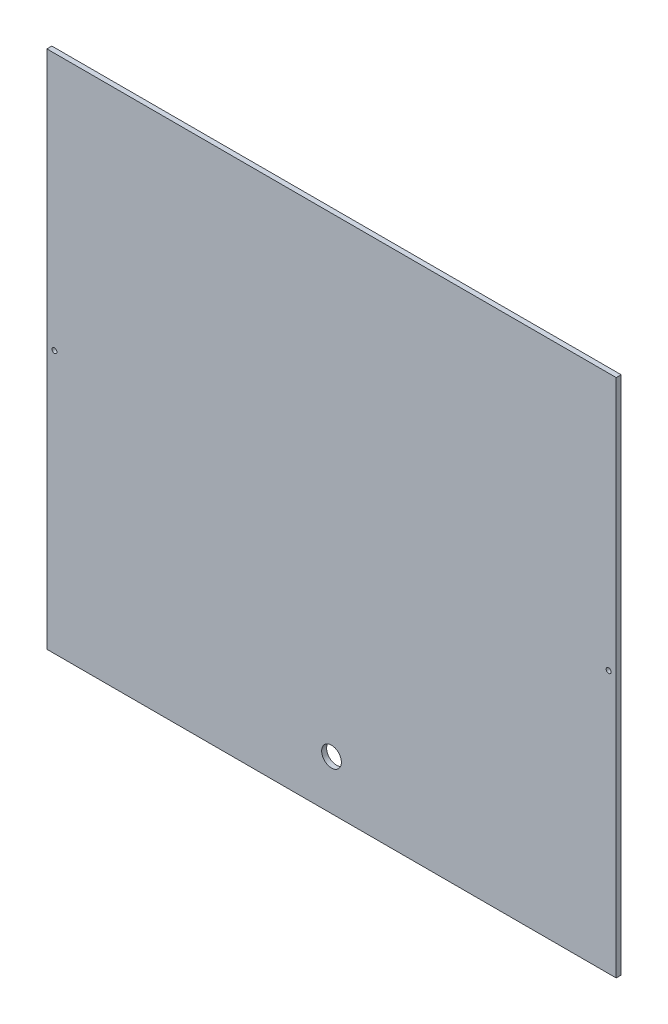
ISO-10303-21;
HEADER;
FILE_DESCRIPTION(('STEP AP214'),'2;1');
FILE_NAME('part.step','',(''),(''),'','','');
FILE_SCHEMA(('AUTOMOTIVE_DESIGN { 1 0 10303 214 1 1 1 1 }'));
ENDSEC;
DATA;
#1=APPLICATION_CONTEXT('core data for automotive mechanical design processes');
#2=APPLICATION_PROTOCOL_DEFINITION('international standard','automotive_design',2000,#1);
#3=PRODUCT_CONTEXT('',#1,'mechanical');
#4=PRODUCT('Part','Part','',(#3));
#5=PRODUCT_RELATED_PRODUCT_CATEGORY('part','',(#4));
#6=PRODUCT_DEFINITION_FORMATION('','',#4);
#7=PRODUCT_DEFINITION_CONTEXT('part definition',#1,'design');
#8=PRODUCT_DEFINITION('design','',#6,#7);
#9=PRODUCT_DEFINITION_SHAPE('','',#8);
#10=(LENGTH_UNIT() NAMED_UNIT(*) SI_UNIT(.MILLI.,.METRE.));
#11=(NAMED_UNIT(*) PLANE_ANGLE_UNIT() SI_UNIT($,.RADIAN.));
#12=(NAMED_UNIT(*) SI_UNIT($,.STERADIAN.) SOLID_ANGLE_UNIT());
#13=UNCERTAINTY_MEASURE_WITH_UNIT(LENGTH_MEASURE(1.E-05),#10,'distance_accuracy_value','');
#14=(GEOMETRIC_REPRESENTATION_CONTEXT(3) GLOBAL_UNCERTAINTY_ASSIGNED_CONTEXT((#13)) GLOBAL_UNIT_ASSIGNED_CONTEXT((#10,
#11,#12)) REPRESENTATION_CONTEXT('',''));
#15=CARTESIAN_POINT('',(0.,0.,0.));
#16=DIRECTION('',(0.,0.,1.));
#17=DIRECTION('',(1.,0.,0.));
#18=AXIS2_PLACEMENT_3D('',#15,#16,#17);
#19=CARTESIAN_POINT('',(0.,0.,5.));
#20=DIRECTION('',(0.,0.,-1.));
#21=DIRECTION('',(-1.,0.,0.));
#22=AXIS2_PLACEMENT_3D('',#19,#20,#21);
#23=PLANE('',#22);
#24=CARTESIAN_POINT('',(288.34878885,50.,5.));
#25=DIRECTION('',(0.,0.,-1.));
#26=DIRECTION('',(-1.,0.,0.));
#27=AXIS2_PLACEMENT_3D('',#24,#25,#26);
#28=CIRCLE('',#27,9.99999999999998);
#29=CARTESIAN_POINT('',(278.34878885,50.,5.));
#30=VERTEX_POINT('',#29);
#31=EDGE_CURVE('E123',#30,#30,#28,.T.);
#32=ORIENTED_EDGE('',*,*,#31,.T.);
#33=EDGE_LOOP('',(#32));
#34=FACE_BOUND('',#33,.T.);
#35=DIRECTION('',(0.,-1.,0.));
#36=VECTOR('',#35,1.);
#37=CARTESIAN_POINT('',(0.,0.,5.));
#38=LINE('',#37,#36);
#39=CARTESIAN_POINT('',(0.,526.6975777,5.));
#40=VERTEX_POINT('',#39);
#41=CARTESIAN_POINT('',(0.,0.,5.));
#42=VERTEX_POINT('',#41);
#43=EDGE_CURVE('E87',#40,#42,#38,.T.);
#44=ORIENTED_EDGE('',*,*,#43,.T.);
#45=DIRECTION('',(1.,0.,0.));
#46=VECTOR('',#45,1.);
#47=CARTESIAN_POINT('',(0.,0.,5.));
#48=LINE('',#47,#46);
#49=CARTESIAN_POINT('',(576.6975777,0.,5.));
#50=VERTEX_POINT('',#49);
#51=EDGE_CURVE('E82',#42,#50,#48,.T.);
#52=ORIENTED_EDGE('',*,*,#51,.T.);
#53=DIRECTION('',(0.,1.,0.));
#54=VECTOR('',#53,1.);
#55=CARTESIAN_POINT('',(576.6975777,0.,5.));
#56=LINE('',#55,#54);
#57=CARTESIAN_POINT('',(576.6975777,526.6975777,5.));
#58=VERTEX_POINT('',#57);
#59=EDGE_CURVE('E85',#50,#58,#56,.T.);
#60=ORIENTED_EDGE('',*,*,#59,.T.);
#61=DIRECTION('',(-1.,0.,0.));
#62=VECTOR('',#61,1.);
#63=CARTESIAN_POINT('',(0.,526.6975777,5.));
#64=LINE('',#63,#62);
#65=EDGE_CURVE('E52',#58,#40,#64,.T.);
#66=ORIENTED_EDGE('',*,*,#65,.T.);
#67=EDGE_LOOP('',(#44,#52,#60,#66));
#68=FACE_BOUND('',#67,.T.);
#69=CARTESIAN_POINT('',(569.053383985024,265.84878885,5.));
#70=DIRECTION('',(0.,0.,1.));
#71=DIRECTION('',(1.,0.,0.));
#72=AXIS2_PLACEMENT_3D('',#69,#70,#71);
#73=CIRCLE('',#72,2.50000000000002);
#74=CARTESIAN_POINT('',(571.553383985024,265.84878885,5.));
#75=VERTEX_POINT('',#74);
#76=EDGE_CURVE('E102',#75,#75,#73,.T.);
#77=ORIENTED_EDGE('',*,*,#76,.F.);
#78=EDGE_LOOP('',(#77));
#79=FACE_BOUND('',#78,.T.);
#80=CARTESIAN_POINT('',(7.6441937149761,265.84878885,5.));
#81=DIRECTION('',(0.,0.,1.));
#82=DIRECTION('',(1.,0.,0.));
#83=AXIS2_PLACEMENT_3D('',#80,#81,#82);
#84=CIRCLE('',#83,2.50000000000003);
#85=CARTESIAN_POINT('',(10.1441937149761,265.84878885,5.));
#86=VERTEX_POINT('',#85);
#87=EDGE_CURVE('E117',#86,#86,#84,.T.);
#88=ORIENTED_EDGE('',*,*,#87,.F.);
#89=EDGE_LOOP('',(#88));
#90=FACE_BOUND('',#89,.T.);
#91=ADVANCED_FACE('F35',(#34,#68,#79,#90),#23,.F.);
#92=CARTESIAN_POINT('',(0.,0.,0.));
#93=DIRECTION('',(0.,0.,-1.));
#94=DIRECTION('',(-1.,0.,0.));
#95=AXIS2_PLACEMENT_3D('',#92,#93,#94);
#96=PLANE('',#95);
#97=CARTESIAN_POINT('',(288.34878885,50.,0.));
#98=DIRECTION('',(0.,0.,-1.));
#99=DIRECTION('',(-1.,0.,0.));
#100=AXIS2_PLACEMENT_3D('',#97,#98,#99);
#101=CIRCLE('',#100,9.99999999999998);
#102=CARTESIAN_POINT('',(278.34878885,50.,0.));
#103=VERTEX_POINT('',#102);
#104=EDGE_CURVE('E128',#103,#103,#101,.T.);
#105=ORIENTED_EDGE('',*,*,#104,.F.);
#106=EDGE_LOOP('',(#105));
#107=FACE_BOUND('',#106,.T.);
#108=CARTESIAN_POINT('',(569.053383985024,265.84878885,0.));
#109=DIRECTION('',(0.,0.,1.));
#110=DIRECTION('',(1.,0.,0.));
#111=AXIS2_PLACEMENT_3D('',#108,#109,#110);
#112=CIRCLE('',#111,2.50000000000002);
#113=CARTESIAN_POINT('',(571.553383985024,265.84878885,0.));
#114=VERTEX_POINT('',#113);
#115=EDGE_CURVE('E114',#114,#114,#112,.T.);
#116=ORIENTED_EDGE('',*,*,#115,.T.);
#117=EDGE_LOOP('',(#116));
#118=FACE_BOUND('',#117,.T.);
#119=DIRECTION('',(0.,-1.,0.));
#120=VECTOR('',#119,1.);
#121=CARTESIAN_POINT('',(0.,0.,0.));
#122=LINE('',#121,#120);
#123=CARTESIAN_POINT('',(0.,526.6975777,0.));
#124=VERTEX_POINT('',#123);
#125=CARTESIAN_POINT('',(0.,0.,0.));
#126=VERTEX_POINT('',#125);
#127=EDGE_CURVE('E99',#124,#126,#122,.T.);
#128=ORIENTED_EDGE('',*,*,#127,.F.);
#129=DIRECTION('',(-1.,0.,0.));
#130=VECTOR('',#129,1.);
#131=CARTESIAN_POINT('',(0.,526.6975777,0.));
#132=LINE('',#131,#130);
#133=CARTESIAN_POINT('',(576.6975777,526.6975777,0.));
#134=VERTEX_POINT('',#133);
#135=EDGE_CURVE('E75',#134,#124,#132,.T.);
#136=ORIENTED_EDGE('',*,*,#135,.F.);
#137=DIRECTION('',(0.,1.,0.));
#138=VECTOR('',#137,1.);
#139=CARTESIAN_POINT('',(576.6975777,0.,0.));
#140=LINE('',#139,#138);
#141=CARTESIAN_POINT('',(576.6975777,0.,0.));
#142=VERTEX_POINT('',#141);
#143=EDGE_CURVE('E69',#142,#134,#140,.T.);
#144=ORIENTED_EDGE('',*,*,#143,.F.);
#145=DIRECTION('',(1.,0.,0.));
#146=VECTOR('',#145,1.);
#147=CARTESIAN_POINT('',(0.,0.,0.));
#148=LINE('',#147,#146);
#149=EDGE_CURVE('E91',#126,#142,#148,.T.);
#150=ORIENTED_EDGE('',*,*,#149,.F.);
#151=EDGE_LOOP('',(#128,#136,#144,#150));
#152=FACE_BOUND('',#151,.T.);
#153=CARTESIAN_POINT('',(7.6441937149761,265.84878885,0.));
#154=DIRECTION('',(0.,0.,1.));
#155=DIRECTION('',(1.,0.,0.));
#156=AXIS2_PLACEMENT_3D('',#153,#154,#155);
#157=CIRCLE('',#156,2.50000000000003);
#158=CARTESIAN_POINT('',(10.1441937149761,265.84878885,0.));
#159=VERTEX_POINT('',#158);
#160=EDGE_CURVE('E120',#159,#159,#157,.T.);
#161=ORIENTED_EDGE('',*,*,#160,.T.);
#162=EDGE_LOOP('',(#161));
#163=FACE_BOUND('',#162,.T.);
#164=ADVANCED_FACE('F110',(#107,#118,#152,#163),#96,.T.);
#165=CARTESIAN_POINT('',(0.,0.,5.));
#166=DIRECTION('',(1.,0.,0.));
#167=DIRECTION('',(0.,0.,-1.));
#168=AXIS2_PLACEMENT_3D('',#165,#166,#167);
#169=PLANE('',#168);
#170=ORIENTED_EDGE('',*,*,#127,.T.);
#171=DIRECTION('',(0.,0.,-1.));
#172=VECTOR('',#171,1.);
#173=CARTESIAN_POINT('',(0.,0.,5.));
#174=LINE('',#173,#172);
#175=EDGE_CURVE('E11',#42,#126,#174,.T.);
#176=ORIENTED_EDGE('',*,*,#175,.F.);
#177=ORIENTED_EDGE('',*,*,#43,.F.);
#178=DIRECTION('',(0.,0.,-1.));
#179=VECTOR('',#178,1.);
#180=CARTESIAN_POINT('',(0.,526.6975777,5.));
#181=LINE('',#180,#179);
#182=EDGE_CURVE('E95',#40,#124,#181,.T.);
#183=ORIENTED_EDGE('',*,*,#182,.T.);
#184=EDGE_LOOP('',(#170,#176,#177,#183));
#185=FACE_BOUND('',#184,.T.);
#186=ADVANCED_FACE('F37',(#185),#169,.F.);
#187=CARTESIAN_POINT('',(0.,0.,5.));
#188=DIRECTION('',(0.,1.,0.));
#189=DIRECTION('',(-1.,0.,0.));
#190=AXIS2_PLACEMENT_3D('',#187,#188,#189);
#191=PLANE('',#190);
#192=ORIENTED_EDGE('',*,*,#149,.T.);
#193=DIRECTION('',(0.,0.,-1.));
#194=VECTOR('',#193,1.);
#195=CARTESIAN_POINT('',(576.6975777,0.,5.));
#196=LINE('',#195,#194);
#197=EDGE_CURVE('E44',#50,#142,#196,.T.);
#198=ORIENTED_EDGE('',*,*,#197,.F.);
#199=ORIENTED_EDGE('',*,*,#51,.F.);
#200=ORIENTED_EDGE('',*,*,#175,.T.);
#201=EDGE_LOOP('',(#192,#198,#199,#200));
#202=FACE_BOUND('',#201,.T.);
#203=ADVANCED_FACE('F90',(#202),#191,.F.);
#204=CARTESIAN_POINT('',(576.6975777,0.,5.));
#205=DIRECTION('',(-1.,0.,0.));
#206=DIRECTION('',(0.,-1.,0.));
#207=AXIS2_PLACEMENT_3D('',#204,#205,#206);
#208=PLANE('',#207);
#209=ORIENTED_EDGE('',*,*,#143,.T.);
#210=DIRECTION('',(0.,0.,-1.));
#211=VECTOR('',#210,1.);
#212=CARTESIAN_POINT('',(576.6975777,526.6975777,5.));
#213=LINE('',#212,#211);
#214=EDGE_CURVE('E92',#58,#134,#213,.T.);
#215=ORIENTED_EDGE('',*,*,#214,.F.);
#216=ORIENTED_EDGE('',*,*,#59,.F.);
#217=ORIENTED_EDGE('',*,*,#197,.T.);
#218=EDGE_LOOP('',(#209,#215,#216,#217));
#219=FACE_BOUND('',#218,.T.);
#220=ADVANCED_FACE('F93',(#219),#208,.F.);
#221=CARTESIAN_POINT('',(0.,526.6975777,5.));
#222=DIRECTION('',(0.,-1.,0.));
#223=DIRECTION('',(1.,0.,0.));
#224=AXIS2_PLACEMENT_3D('',#221,#222,#223);
#225=PLANE('',#224);
#226=ORIENTED_EDGE('',*,*,#135,.T.);
#227=ORIENTED_EDGE('',*,*,#182,.F.);
#228=ORIENTED_EDGE('',*,*,#65,.F.);
#229=ORIENTED_EDGE('',*,*,#214,.T.);
#230=EDGE_LOOP('',(#226,#227,#228,#229));
#231=FACE_BOUND('',#230,.T.);
#232=ADVANCED_FACE('F107',(#231),#225,.F.);
#233=CARTESIAN_POINT('',(569.053383985024,265.84878885,5.));
#234=DIRECTION('',(0.,0.,-1.));
#235=DIRECTION('',(-1.,0.,0.));
#236=AXIS2_PLACEMENT_3D('',#233,#234,#235);
#237=CYLINDRICAL_SURFACE('',#236,2.50000000000002);
#238=ORIENTED_EDGE('',*,*,#76,.T.);
#239=EDGE_LOOP('',(#238));
#240=FACE_BOUND('',#239,.T.);
#241=ORIENTED_EDGE('',*,*,#115,.F.);
#242=EDGE_LOOP('',(#241));
#243=FACE_BOUND('',#242,.T.);
#244=ADVANCED_FACE('F140',(#240,#243),#237,.F.);
#245=CARTESIAN_POINT('',(7.6441937149761,265.84878885,5.));
#246=DIRECTION('',(0.,0.,-1.));
#247=DIRECTION('',(-1.,0.,0.));
#248=AXIS2_PLACEMENT_3D('',#245,#246,#247);
#249=CYLINDRICAL_SURFACE('',#248,2.50000000000003);
#250=ORIENTED_EDGE('',*,*,#87,.T.);
#251=EDGE_LOOP('',(#250));
#252=FACE_BOUND('',#251,.T.);
#253=ORIENTED_EDGE('',*,*,#160,.F.);
#254=EDGE_LOOP('',(#253));
#255=FACE_BOUND('',#254,.T.);
#256=ADVANCED_FACE('F142',(#252,#255),#249,.F.);
#257=CARTESIAN_POINT('',(288.34878885,50.,10.));
#258=DIRECTION('',(0.,0.,-1.));
#259=DIRECTION('',(-1.,0.,0.));
#260=AXIS2_PLACEMENT_3D('',#257,#258,#259);
#261=CYLINDRICAL_SURFACE('',#260,9.99999999999998);
#262=ORIENTED_EDGE('',*,*,#104,.T.);
#263=EDGE_LOOP('',(#262));
#264=FACE_BOUND('',#263,.T.);
#265=ORIENTED_EDGE('',*,*,#31,.F.);
#266=EDGE_LOOP('',(#265));
#267=FACE_BOUND('',#266,.T.);
#268=ADVANCED_FACE('F132',(#264,#267),#261,.F.);
#269=CLOSED_SHELL('',(#91,#164,#186,#203,#220,#232,#244,#256,#268));
#270=MANIFOLD_SOLID_BREP('B2',#269);
#271=ADVANCED_BREP_SHAPE_REPRESENTATION('',(#18,#270),#14);
#272=SHAPE_DEFINITION_REPRESENTATION(#9,#271);
ENDSEC;
END-ISO-10303-21;
